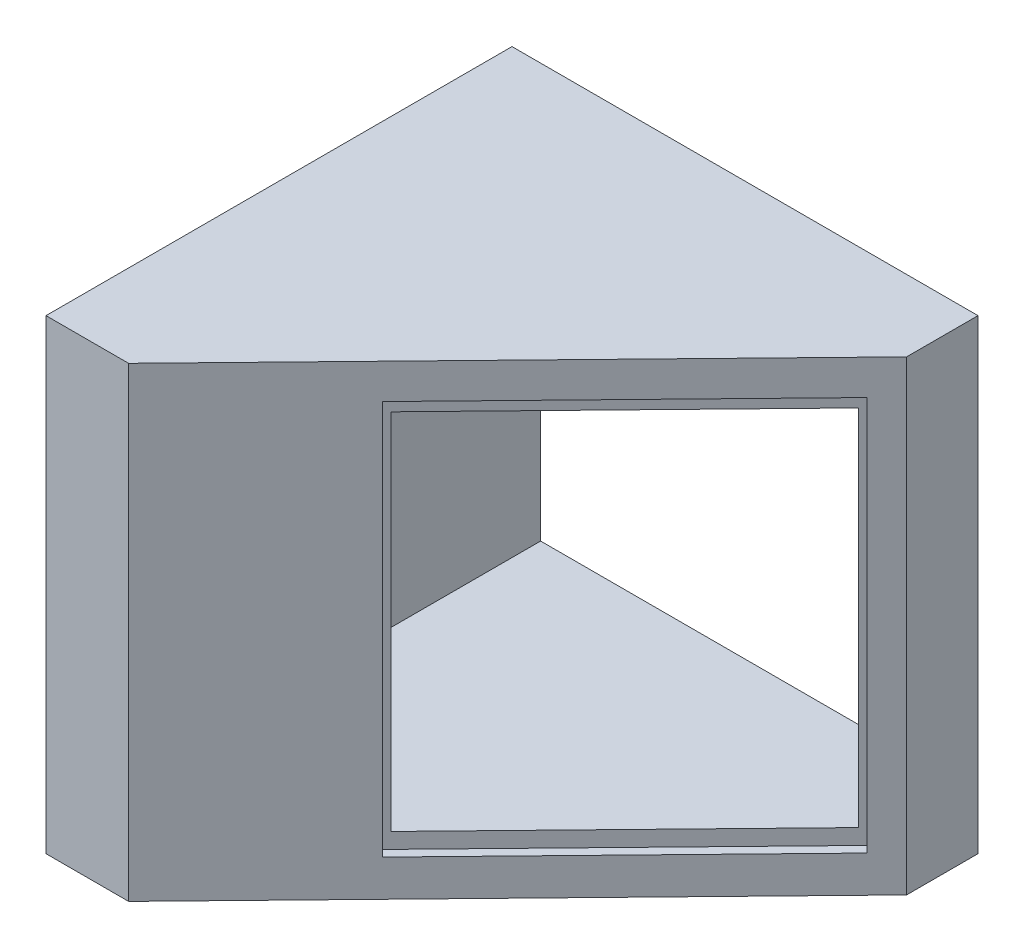
ISO-10303-21;
HEADER;
FILE_DESCRIPTION(('STEP AP214'),'2;1');
FILE_NAME('part.step','',(''),(''),'','','');
FILE_SCHEMA(('AUTOMOTIVE_DESIGN { 1 0 10303 214 1 1 1 1 }'));
ENDSEC;
DATA;
#1=APPLICATION_CONTEXT('core data for automotive mechanical design processes');
#2=APPLICATION_PROTOCOL_DEFINITION('international standard','automotive_design',2000,#1);
#3=PRODUCT_CONTEXT('',#1,'mechanical');
#4=PRODUCT('Part','Part','',(#3));
#5=PRODUCT_RELATED_PRODUCT_CATEGORY('part','',(#4));
#6=PRODUCT_DEFINITION_FORMATION('','',#4);
#7=PRODUCT_DEFINITION_CONTEXT('part definition',#1,'design');
#8=PRODUCT_DEFINITION('design','',#6,#7);
#9=PRODUCT_DEFINITION_SHAPE('','',#8);
#10=(LENGTH_UNIT() NAMED_UNIT(*) SI_UNIT(.MILLI.,.METRE.));
#11=(NAMED_UNIT(*) PLANE_ANGLE_UNIT() SI_UNIT($,.RADIAN.));
#12=(NAMED_UNIT(*) SI_UNIT($,.STERADIAN.) SOLID_ANGLE_UNIT());
#13=UNCERTAINTY_MEASURE_WITH_UNIT(LENGTH_MEASURE(1.E-05),#10,'distance_accuracy_value','');
#14=(GEOMETRIC_REPRESENTATION_CONTEXT(3) GLOBAL_UNCERTAINTY_ASSIGNED_CONTEXT((#13)) GLOBAL_UNIT_ASSIGNED_CONTEXT((#10,
#11,#12)) REPRESENTATION_CONTEXT('',''));
#15=CARTESIAN_POINT('',(0.,0.,0.));
#16=DIRECTION('',(0.,0.,1.));
#17=DIRECTION('',(1.,0.,0.));
#18=AXIS2_PLACEMENT_3D('',#15,#16,#17);
#19=CARTESIAN_POINT('',(51.5509401054222,54.4883165125637,105.));
#20=DIRECTION('',(0.,1.,0.));
#21=DIRECTION('',(0.,0.,1.));
#22=AXIS2_PLACEMENT_3D('',#19,#20,#21);
#23=PLANE('',#22);
#24=DIRECTION('',(0.696812609304925,0.,-0.71725322412218));
#25=VECTOR('',#24,1.);
#26=CARTESIAN_POINT('',(52.8832434795801,54.4883165125637,27.3206280029093));
#27=LINE('',#26,#25);
#28=CARTESIAN_POINT('',(-22.5823857711019,54.4883165125637,105.));
#29=VERTEX_POINT('',#28);
#30=CARTESIAN_POINT('',(51.5509401054222,54.4883165125637,28.6920137641069));
#31=VERTEX_POINT('',#30);
#32=EDGE_CURVE('E158',#29,#31,#27,.T.);
#33=ORIENTED_EDGE('',*,*,#32,.F.);
#34=DIRECTION('',(1.,0.,0.));
#35=VECTOR('',#34,1.);
#36=CARTESIAN_POINT('',(51.5509401054222,54.4883165125637,105.));
#37=LINE('',#36,#35);
#38=CARTESIAN_POINT('',(-79.4933732269255,54.4883165125637,105.));
#39=VERTEX_POINT('',#38);
#40=EDGE_CURVE('E192',#39,#29,#37,.T.);
#41=ORIENTED_EDGE('',*,*,#40,.F.);
#42=DIRECTION('',(0.,0.,-1.));
#43=VECTOR('',#42,1.);
#44=CARTESIAN_POINT('',(-79.4933732269255,54.4883165125637,105.));
#45=LINE('',#44,#43);
#46=CARTESIAN_POINT('',(-79.4933732269255,54.4883165125637,0.));
#47=VERTEX_POINT('',#46);
#48=EDGE_CURVE('E206',#39,#47,#45,.T.);
#49=ORIENTED_EDGE('',*,*,#48,.T.);
#50=DIRECTION('',(1.,0.,0.));
#51=VECTOR('',#50,1.);
#52=CARTESIAN_POINT('',(51.5509401054222,54.4883165125637,0.));
#53=LINE('',#52,#51);
#54=CARTESIAN_POINT('',(51.5509401054222,54.4883165125637,0.));
#55=VERTEX_POINT('',#54);
#56=EDGE_CURVE('E189',#47,#55,#53,.T.);
#57=ORIENTED_EDGE('',*,*,#56,.T.);
#58=DIRECTION('',(0.,0.,-1.));
#59=VECTOR('',#58,1.);
#60=CARTESIAN_POINT('',(51.5509401054222,54.4883165125637,105.));
#61=LINE('',#60,#59);
#62=EDGE_CURVE('E203',#31,#55,#61,.T.);
#63=ORIENTED_EDGE('',*,*,#62,.F.);
#64=EDGE_LOOP('',(#33,#41,#49,#57,#63));
#65=FACE_BOUND('',#64,.T.);
#66=ADVANCED_FACE('F35',(#65),#23,.F.);
#67=CARTESIAN_POINT('',(0.,0.,105.));
#68=DIRECTION('',(0.,0.,-1.));
#69=DIRECTION('',(-1.,0.,0.));
#70=AXIS2_PLACEMENT_3D('',#67,#68,#69);
#71=PLANE('',#70);
#72=ORIENTED_EDGE('',*,*,#40,.T.);
#73=DIRECTION('',(0.,-1.,0.));
#74=VECTOR('',#73,1.);
#75=CARTESIAN_POINT('',(-22.5823857711019,0.,105.));
#76=LINE('',#75,#74);
#77=CARTESIAN_POINT('',(-22.5823857711019,-62.4896774723498,105.));
#78=VERTEX_POINT('',#77);
#79=EDGE_CURVE('E11',#29,#78,#76,.T.);
#80=ORIENTED_EDGE('',*,*,#79,.T.);
#81=DIRECTION('',(-1.,0.,0.));
#82=VECTOR('',#81,1.);
#83=CARTESIAN_POINT('',(51.5509401054221,-62.4896774723498,105.));
#84=LINE('',#83,#82);
#85=CARTESIAN_POINT('',(-79.4933732269256,-62.4896774723498,105.));
#86=VERTEX_POINT('',#85);
#87=EDGE_CURVE('E186',#78,#86,#84,.T.);
#88=ORIENTED_EDGE('',*,*,#87,.T.);
#89=DIRECTION('',(0.,1.,0.));
#90=VECTOR('',#89,1.);
#91=CARTESIAN_POINT('',(-79.4933732269255,54.4883165125637,105.));
#92=LINE('',#91,#90);
#93=EDGE_CURVE('E188',#86,#39,#92,.T.);
#94=ORIENTED_EDGE('',*,*,#93,.T.);
#95=EDGE_LOOP('',(#72,#80,#88,#94));
#96=FACE_BOUND('',#95,.T.);
#97=ADVANCED_FACE('F285',(#96),#71,.T.);
#98=CARTESIAN_POINT('',(-88.7126445139242,70.7407474732786,150.));
#99=DIRECTION('',(1.,0.,0.));
#100=DIRECTION('',(0.,1.,0.));
#101=AXIS2_PLACEMENT_3D('',#98,#99,#100);
#102=PLANE('',#101);
#103=DIRECTION('',(0.,-1.,0.));
#104=VECTOR('',#103,1.);
#105=CARTESIAN_POINT('',(-88.7126445139242,70.7407474732786,0.));
#106=LINE('',#105,#104);
#107=CARTESIAN_POINT('',(-88.7126445139242,70.7407474732786,0.));
#108=VERTEX_POINT('',#107);
#109=CARTESIAN_POINT('',(-88.7126445139242,-79.2592525267214,0.));
#110=VERTEX_POINT('',#109);
#111=EDGE_CURVE('E219',#108,#110,#106,.T.);
#112=ORIENTED_EDGE('',*,*,#111,.T.);
#113=DIRECTION('',(0.,0.,-1.));
#114=VECTOR('',#113,1.);
#115=CARTESIAN_POINT('',(-88.7126445139242,-79.2592525267214,150.));
#116=LINE('',#115,#114);
#117=CARTESIAN_POINT('',(-88.7126445139242,-79.2592525267214,150.));
#118=VERTEX_POINT('',#117);
#119=EDGE_CURVE('E43',#118,#110,#116,.T.);
#120=ORIENTED_EDGE('',*,*,#119,.F.);
#121=DIRECTION('',(0.,-1.,0.));
#122=VECTOR('',#121,1.);
#123=CARTESIAN_POINT('',(-88.7126445139242,70.7407474732786,150.));
#124=LINE('',#123,#122);
#125=CARTESIAN_POINT('',(-88.7126445139242,70.7407474732786,150.));
#126=VERTEX_POINT('',#125);
#127=EDGE_CURVE('E221',#126,#118,#124,.T.);
#128=ORIENTED_EDGE('',*,*,#127,.F.);
#129=DIRECTION('',(0.,0.,-1.));
#130=VECTOR('',#129,1.);
#131=CARTESIAN_POINT('',(-88.7126445139242,70.7407474732786,150.));
#132=LINE('',#131,#130);
#133=EDGE_CURVE('E230',#126,#108,#132,.T.);
#134=ORIENTED_EDGE('',*,*,#133,.T.);
#135=EDGE_LOOP('',(#112,#120,#128,#134));
#136=FACE_BOUND('',#135,.T.);
#137=ADVANCED_FACE('F37',(#136),#102,.F.);
#138=CARTESIAN_POINT('',(-88.7126445139242,-79.2592525267214,150.));
#139=DIRECTION('',(0.,1.,0.));
#140=DIRECTION('',(0.,0.,1.));
#141=AXIS2_PLACEMENT_3D('',#138,#139,#140);
#142=PLANE('',#141);
#143=DIRECTION('',(0.,0.,-1.));
#144=VECTOR('',#143,1.);
#145=CARTESIAN_POINT('',(61.2873554860758,-79.2592525267214,150.));
#146=LINE('',#145,#144);
#147=CARTESIAN_POINT('',(61.2873554860758,-79.2592525267214,22.9753041782399));
#148=VERTEX_POINT('',#147);
#149=CARTESIAN_POINT('',(61.2873554860758,-79.2592525267214,0.));
#150=VERTEX_POINT('',#149);
#151=EDGE_CURVE('E244',#148,#150,#146,.T.);
#152=ORIENTED_EDGE('',*,*,#151,.F.);
#153=DIRECTION('',(0.696812609304925,0.,-0.71725322412218));
#154=VECTOR('',#153,1.);
#155=CARTESIAN_POINT('',(61.2873554860758,-79.2592525267214,22.9753041782399));
#156=LINE('',#155,#154);
#157=CARTESIAN_POINT('',(-62.1173316800951,-79.2592525267214,150.));
#158=VERTEX_POINT('',#157);
#159=EDGE_CURVE('E205',#158,#148,#156,.T.);
#160=ORIENTED_EDGE('',*,*,#159,.F.);
#161=DIRECTION('',(1.,0.,0.));
#162=VECTOR('',#161,1.);
#163=CARTESIAN_POINT('',(-88.7126445139242,-79.2592525267214,150.));
#164=LINE('',#163,#162);
#165=EDGE_CURVE('E224',#118,#158,#164,.T.);
#166=ORIENTED_EDGE('',*,*,#165,.F.);
#167=ORIENTED_EDGE('',*,*,#119,.T.);
#168=DIRECTION('',(1.,0.,0.));
#169=VECTOR('',#168,1.);
#170=CARTESIAN_POINT('',(-88.7126445139242,-79.2592525267214,0.));
#171=LINE('',#170,#169);
#172=EDGE_CURVE('E233',#110,#150,#171,.T.);
#173=ORIENTED_EDGE('',*,*,#172,.T.);
#174=EDGE_LOOP('',(#152,#160,#166,#167,#173));
#175=FACE_BOUND('',#174,.T.);
#176=ADVANCED_FACE('F249',(#175),#142,.F.);
#177=CARTESIAN_POINT('',(61.2873554860758,70.7407474732786,150.));
#178=DIRECTION('',(-1.,0.,0.));
#179=DIRECTION('',(0.,-1.,0.));
#180=AXIS2_PLACEMENT_3D('',#177,#178,#179);
#181=PLANE('',#180);
#182=DIRECTION('',(0.,0.,-1.));
#183=VECTOR('',#182,1.);
#184=CARTESIAN_POINT('',(61.2873554860758,70.7407474732786,150.));
#185=LINE('',#184,#183);
#186=CARTESIAN_POINT('',(61.2873554860758,70.7407474732786,22.9753041782399));
#187=VERTEX_POINT('',#186);
#188=CARTESIAN_POINT('',(61.2873554860758,70.7407474732786,0.));
#189=VERTEX_POINT('',#188);
#190=EDGE_CURVE('E242',#187,#189,#185,.T.);
#191=ORIENTED_EDGE('',*,*,#190,.F.);
#192=DIRECTION('',(0.,-1.,0.));
#193=VECTOR('',#192,1.);
#194=CARTESIAN_POINT('',(61.2873554860758,70.7407474732786,22.9753041782399));
#195=LINE('',#194,#193);
#196=EDGE_CURVE('E216',#187,#148,#195,.T.);
#197=ORIENTED_EDGE('',*,*,#196,.T.);
#198=ORIENTED_EDGE('',*,*,#151,.T.);
#199=DIRECTION('',(0.,1.,0.));
#200=VECTOR('',#199,1.);
#201=CARTESIAN_POINT('',(61.2873554860758,70.7407474732786,0.));
#202=LINE('',#201,#200);
#203=EDGE_CURVE('E236',#150,#189,#202,.T.);
#204=ORIENTED_EDGE('',*,*,#203,.T.);
#205=EDGE_LOOP('',(#191,#197,#198,#204));
#206=FACE_BOUND('',#205,.T.);
#207=ADVANCED_FACE('F261',(#206),#181,.F.);
#208=CARTESIAN_POINT('',(-88.7126445139242,70.7407474732786,150.));
#209=DIRECTION('',(0.,-1.,0.));
#210=DIRECTION('',(0.,0.,-1.));
#211=AXIS2_PLACEMENT_3D('',#208,#209,#210);
#212=PLANE('',#211);
#213=DIRECTION('',(-1.,0.,0.));
#214=VECTOR('',#213,1.);
#215=CARTESIAN_POINT('',(-88.7126445139242,70.7407474732786,150.));
#216=LINE('',#215,#214);
#217=CARTESIAN_POINT('',(-62.1173316800951,70.7407474732786,150.));
#218=VERTEX_POINT('',#217);
#219=EDGE_CURVE('E228',#218,#126,#216,.T.);
#220=ORIENTED_EDGE('',*,*,#219,.F.);
#221=DIRECTION('',(0.696812609304925,0.,-0.71725322412218));
#222=VECTOR('',#221,1.);
#223=CARTESIAN_POINT('',(61.2873554860758,70.7407474732786,22.9753041782399));
#224=LINE('',#223,#222);
#225=EDGE_CURVE('E211',#218,#187,#224,.T.);
#226=ORIENTED_EDGE('',*,*,#225,.T.);
#227=ORIENTED_EDGE('',*,*,#190,.T.);
#228=DIRECTION('',(-1.,0.,0.));
#229=VECTOR('',#228,1.);
#230=CARTESIAN_POINT('',(-88.7126445139242,70.7407474732786,0.));
#231=LINE('',#230,#229);
#232=EDGE_CURVE('E225',#189,#108,#231,.T.);
#233=ORIENTED_EDGE('',*,*,#232,.T.);
#234=ORIENTED_EDGE('',*,*,#133,.F.);
#235=EDGE_LOOP('',(#220,#226,#227,#233,#234));
#236=FACE_BOUND('',#235,.T.);
#237=ADVANCED_FACE('F268',(#236),#212,.F.);
#238=CARTESIAN_POINT('',(0.,0.,150.));
#239=DIRECTION('',(0.,0.,1.));
#240=DIRECTION('',(1.,0.,0.));
#241=AXIS2_PLACEMENT_3D('',#238,#239,#240);
#242=PLANE('',#241);
#243=DIRECTION('',(0.,-1.,0.));
#244=VECTOR('',#243,1.);
#245=CARTESIAN_POINT('',(-62.1173316800951,70.7407474732786,150.));
#246=LINE('',#245,#244);
#247=EDGE_CURVE('E214',#218,#158,#246,.T.);
#248=ORIENTED_EDGE('',*,*,#247,.F.);
#249=ORIENTED_EDGE('',*,*,#219,.T.);
#250=ORIENTED_EDGE('',*,*,#127,.T.);
#251=ORIENTED_EDGE('',*,*,#165,.T.);
#252=EDGE_LOOP('',(#248,#249,#250,#251));
#253=FACE_BOUND('',#252,.T.);
#254=ADVANCED_FACE('F265',(#253),#242,.T.);
#255=CARTESIAN_POINT('',(0.,0.,0.));
#256=DIRECTION('',(0.,0.,1.));
#257=DIRECTION('',(1.,0.,0.));
#258=AXIS2_PLACEMENT_3D('',#255,#256,#257);
#259=PLANE('',#258);
#260=DIRECTION('',(-1.,0.,0.));
#261=VECTOR('',#260,1.);
#262=CARTESIAN_POINT('',(51.5509401054221,-62.4896774723498,0.));
#263=LINE('',#262,#261);
#264=CARTESIAN_POINT('',(51.5509401054221,-62.4896774723498,0.));
#265=VERTEX_POINT('',#264);
#266=CARTESIAN_POINT('',(-79.4933732269256,-62.4896774723498,0.));
#267=VERTEX_POINT('',#266);
#268=EDGE_CURVE('E196',#265,#267,#263,.T.);
#269=ORIENTED_EDGE('',*,*,#268,.F.);
#270=DIRECTION('',(0.,-1.,0.));
#271=VECTOR('',#270,1.);
#272=CARTESIAN_POINT('',(51.5509401054222,54.4883165125637,0.));
#273=LINE('',#272,#271);
#274=EDGE_CURVE('E184',#55,#265,#273,.T.);
#275=ORIENTED_EDGE('',*,*,#274,.F.);
#276=ORIENTED_EDGE('',*,*,#56,.F.);
#277=DIRECTION('',(0.,1.,0.));
#278=VECTOR('',#277,1.);
#279=CARTESIAN_POINT('',(-79.4933732269255,54.4883165125637,0.));
#280=LINE('',#279,#278);
#281=EDGE_CURVE('E198',#267,#47,#280,.T.);
#282=ORIENTED_EDGE('',*,*,#281,.F.);
#283=EDGE_LOOP('',(#269,#275,#276,#282));
#284=FACE_BOUND('',#283,.T.);
#285=ORIENTED_EDGE('',*,*,#111,.F.);
#286=ORIENTED_EDGE('',*,*,#232,.F.);
#287=ORIENTED_EDGE('',*,*,#203,.F.);
#288=ORIENTED_EDGE('',*,*,#172,.F.);
#289=EDGE_LOOP('',(#285,#286,#287,#288));
#290=FACE_BOUND('',#289,.T.);
#291=ADVANCED_FACE('F258',(#284,#290),#259,.F.);
#292=CARTESIAN_POINT('',(61.2873554860758,70.7407474732786,22.9753041782399));
#293=DIRECTION('',(-0.71725322412218,0.,-0.696812609304925));
#294=DIRECTION('',(-0.696812609304925,0.,0.71725322412218));
#295=AXIS2_PLACEMENT_3D('',#292,#293,#294);
#296=PLANE('',#295);
#297=DIRECTION('',(-0.696812609304925,0.,0.71725322412218));
#298=VECTOR('',#297,1.);
#299=CARTESIAN_POINT('',(55.0350031519468,59.4883165125637,29.4110658308243));
#300=LINE('',#299,#298);
#301=CARTESIAN_POINT('',(55.0350031519468,59.4883165125637,29.4110658308243));
#302=VERTEX_POINT('',#301);
#303=CARTESIAN_POINT('',(-21.8523758084735,59.4883165125637,108.553893783773));
#304=VERTEX_POINT('',#303);
#305=EDGE_CURVE('E163',#302,#304,#300,.T.);
#306=ORIENTED_EDGE('',*,*,#305,.F.);
#307=DIRECTION('',(0.,1.,0.));
#308=VECTOR('',#307,1.);
#309=CARTESIAN_POINT('',(55.0350031519468,-67.4896774723498,29.4110658308243));
#310=LINE('',#309,#308);
#311=CARTESIAN_POINT('',(55.0350031519468,-67.4896774723498,29.4110658308243));
#312=VERTEX_POINT('',#311);
#313=EDGE_CURVE('E148',#312,#302,#310,.T.);
#314=ORIENTED_EDGE('',*,*,#313,.F.);
#315=DIRECTION('',(0.696812609304925,0.,-0.71725322412218));
#316=VECTOR('',#315,1.);
#317=CARTESIAN_POINT('',(-21.8523758084735,-67.4896774723498,108.553893783773));
#318=LINE('',#317,#316);
#319=CARTESIAN_POINT('',(-21.8523758084735,-67.4896774723498,108.553893783773));
#320=VERTEX_POINT('',#319);
#321=EDGE_CURVE('E174',#320,#312,#318,.T.);
#322=ORIENTED_EDGE('',*,*,#321,.F.);
#323=DIRECTION('',(0.,-1.,0.));
#324=VECTOR('',#323,1.);
#325=CARTESIAN_POINT('',(-21.8523758084735,-62.4896774723498,108.553893783774));
#326=LINE('',#325,#324);
#327=EDGE_CURVE('E181',#304,#320,#326,.T.);
#328=ORIENTED_EDGE('',*,*,#327,.F.);
#329=EDGE_LOOP('',(#306,#314,#322,#328));
#330=FACE_BOUND('',#329,.T.);
#331=ORIENTED_EDGE('',*,*,#159,.T.);
#332=ORIENTED_EDGE('',*,*,#196,.F.);
#333=ORIENTED_EDGE('',*,*,#225,.F.);
#334=ORIENTED_EDGE('',*,*,#247,.T.);
#335=EDGE_LOOP('',(#331,#332,#333,#334));
#336=FACE_BOUND('',#335,.T.);
#337=ADVANCED_FACE('F269',(#330,#336),#296,.F.);
#338=CARTESIAN_POINT('',(51.5509401054222,54.4883165125637,105.));
#339=DIRECTION('',(1.,0.,0.));
#340=DIRECTION('',(0.,1.,0.));
#341=AXIS2_PLACEMENT_3D('',#338,#339,#340);
#342=PLANE('',#341);
#343=DIRECTION('',(0.,0.,-1.));
#344=VECTOR('',#343,1.);
#345=CARTESIAN_POINT('',(51.5509401054221,-62.4896774723498,105.));
#346=LINE('',#345,#344);
#347=CARTESIAN_POINT('',(51.5509401054221,-62.4896774723498,28.6920137641069));
#348=VERTEX_POINT('',#347);
#349=EDGE_CURVE('E56',#348,#265,#346,.T.);
#350=ORIENTED_EDGE('',*,*,#349,.F.);
#351=DIRECTION('',(0.,1.,0.));
#352=VECTOR('',#351,1.);
#353=CARTESIAN_POINT('',(51.5509401054222,54.4883165125637,28.6920137641069));
#354=LINE('',#353,#352);
#355=EDGE_CURVE('E171',#348,#31,#354,.T.);
#356=ORIENTED_EDGE('',*,*,#355,.T.);
#357=ORIENTED_EDGE('',*,*,#62,.T.);
#358=ORIENTED_EDGE('',*,*,#274,.T.);
#359=EDGE_LOOP('',(#350,#356,#357,#358));
#360=FACE_BOUND('',#359,.T.);
#361=ADVANCED_FACE('F271',(#360),#342,.F.);
#362=CARTESIAN_POINT('',(51.5509401054221,-62.4896774723498,105.));
#363=DIRECTION('',(0.,-1.,0.));
#364=DIRECTION('',(0.,0.,-1.));
#365=AXIS2_PLACEMENT_3D('',#362,#363,#364);
#366=PLANE('',#365);
#367=DIRECTION('',(-0.696812609304925,0.,0.71725322412218));
#368=VECTOR('',#367,1.);
#369=CARTESIAN_POINT('',(-24.0041354808402,-62.4896774723498,106.463455955859));
#370=LINE('',#369,#368);
#371=EDGE_CURVE('E50',#348,#78,#370,.T.);
#372=ORIENTED_EDGE('',*,*,#371,.F.);
#373=ORIENTED_EDGE('',*,*,#349,.T.);
#374=ORIENTED_EDGE('',*,*,#268,.T.);
#375=DIRECTION('',(0.,0.,-1.));
#376=VECTOR('',#375,1.);
#377=CARTESIAN_POINT('',(-79.4933732269256,-62.4896774723498,105.));
#378=LINE('',#377,#376);
#379=EDGE_CURVE('E208',#86,#267,#378,.T.);
#380=ORIENTED_EDGE('',*,*,#379,.F.);
#381=ORIENTED_EDGE('',*,*,#87,.F.);
#382=EDGE_LOOP('',(#372,#373,#374,#380,#381));
#383=FACE_BOUND('',#382,.T.);
#384=ADVANCED_FACE('F278',(#383),#366,.F.);
#385=CARTESIAN_POINT('',(-79.4933732269255,54.4883165125637,105.));
#386=DIRECTION('',(-1.,0.,0.));
#387=DIRECTION('',(0.,-1.,0.));
#388=AXIS2_PLACEMENT_3D('',#385,#386,#387);
#389=PLANE('',#388);
#390=ORIENTED_EDGE('',*,*,#281,.T.);
#391=ORIENTED_EDGE('',*,*,#48,.F.);
#392=ORIENTED_EDGE('',*,*,#93,.F.);
#393=ORIENTED_EDGE('',*,*,#379,.T.);
#394=EDGE_LOOP('',(#390,#391,#392,#393));
#395=FACE_BOUND('',#394,.T.);
#396=ADVANCED_FACE('F295',(#395),#389,.F.);
#397=CARTESIAN_POINT('',(-24.0041354808402,-62.4896774723498,106.463455955859));
#398=DIRECTION('',(-0.696812609304925,0.,0.71725322412218));
#399=DIRECTION('',(0.71725322412218,0.,0.696812609304925));
#400=AXIS2_PLACEMENT_3D('',#397,#398,#399);
#401=PLANE('',#400);
#402=ORIENTED_EDGE('',*,*,#327,.T.);
#403=DIRECTION('',(0.71725322412218,0.,0.696812609304925));
#404=VECTOR('',#403,1.);
#405=CARTESIAN_POINT('',(-24.0041354808402,-67.4896774723498,106.463455955859));
#406=LINE('',#405,#404);
#407=CARTESIAN_POINT('',(-24.0041354808402,-67.4896774723498,106.463455955859));
#408=VERTEX_POINT('',#407);
#409=EDGE_CURVE('E177',#408,#320,#406,.T.);
#410=ORIENTED_EDGE('',*,*,#409,.F.);
#411=DIRECTION('',(0.,-1.,0.));
#412=VECTOR('',#411,1.);
#413=CARTESIAN_POINT('',(-24.0041354808402,-62.4896774723498,106.463455955859));
#414=LINE('',#413,#412);
#415=CARTESIAN_POINT('',(-24.0041354808402,59.4883165125637,106.463455955859));
#416=VERTEX_POINT('',#415);
#417=EDGE_CURVE('E182',#416,#408,#414,.T.);
#418=ORIENTED_EDGE('',*,*,#417,.F.);
#419=DIRECTION('',(0.71725322412218,0.,0.696812609304925));
#420=VECTOR('',#419,1.);
#421=CARTESIAN_POINT('',(-24.0041354808402,59.4883165125637,106.463455955859));
#422=LINE('',#421,#420);
#423=EDGE_CURVE('E157',#416,#304,#422,.T.);
#424=ORIENTED_EDGE('',*,*,#423,.T.);
#425=EDGE_LOOP('',(#402,#410,#418,#424));
#426=FACE_BOUND('',#425,.T.);
#427=ADVANCED_FACE('F298',(#426),#401,.F.);
#428=CARTESIAN_POINT('',(40.8605067572387,0.,39.6960450974328));
#429=DIRECTION('',(0.717253224122179,0.,0.696812609304926));
#430=DIRECTION('',(0.696812609304926,0.,-0.717253224122179));
#431=AXIS2_PLACEMENT_3D('',#428,#429,#430);
#432=PLANE('',#431);
#433=DIRECTION('',(-0.696812609304925,0.,0.71725322412218));
#434=VECTOR('',#433,1.);
#435=CARTESIAN_POINT('',(52.8832434795801,59.4883165125637,27.3206280029093));
#436=LINE('',#435,#434);
#437=CARTESIAN_POINT('',(52.8832434795801,59.4883165125637,27.3206280029093));
#438=VERTEX_POINT('',#437);
#439=EDGE_CURVE('E141',#438,#416,#436,.T.);
#440=ORIENTED_EDGE('',*,*,#439,.T.);
#441=ORIENTED_EDGE('',*,*,#417,.T.);
#442=DIRECTION('',(0.696812609304925,0.,-0.71725322412218));
#443=VECTOR('',#442,1.);
#444=CARTESIAN_POINT('',(-24.0041354808402,-67.4896774723498,106.463455955859));
#445=LINE('',#444,#443);
#446=CARTESIAN_POINT('',(52.8832434795801,-67.4896774723498,27.3206280029094));
#447=VERTEX_POINT('',#446);
#448=EDGE_CURVE('E143',#408,#447,#445,.T.);
#449=ORIENTED_EDGE('',*,*,#448,.T.);
#450=DIRECTION('',(0.,1.,0.));
#451=VECTOR('',#450,1.);
#452=CARTESIAN_POINT('',(52.8832434795801,-67.4896774723498,27.3206280029094));
#453=LINE('',#452,#451);
#454=EDGE_CURVE('E137',#447,#438,#453,.T.);
#455=ORIENTED_EDGE('',*,*,#454,.T.);
#456=EDGE_LOOP('',(#440,#441,#449,#455));
#457=FACE_BOUND('',#456,.T.);
#458=ORIENTED_EDGE('',*,*,#79,.F.);
#459=ORIENTED_EDGE('',*,*,#32,.T.);
#460=ORIENTED_EDGE('',*,*,#355,.F.);
#461=ORIENTED_EDGE('',*,*,#371,.T.);
#462=EDGE_LOOP('',(#458,#459,#460,#461));
#463=FACE_BOUND('',#462,.T.);
#464=ADVANCED_FACE('F139',(#457,#463),#432,.T.);
#465=CARTESIAN_POINT('',(-24.0041354808402,-67.4896774723498,106.463455955859));
#466=DIRECTION('',(0.,-1.,0.));
#467=DIRECTION('',(0.,0.,-1.));
#468=AXIS2_PLACEMENT_3D('',#465,#466,#467);
#469=PLANE('',#468);
#470=ORIENTED_EDGE('',*,*,#321,.T.);
#471=DIRECTION('',(0.71725322412218,0.,0.696812609304925));
#472=VECTOR('',#471,1.);
#473=CARTESIAN_POINT('',(52.8832434795801,-67.4896774723498,27.3206280029094));
#474=LINE('',#473,#472);
#475=EDGE_CURVE('E147',#447,#312,#474,.T.);
#476=ORIENTED_EDGE('',*,*,#475,.F.);
#477=ORIENTED_EDGE('',*,*,#448,.F.);
#478=ORIENTED_EDGE('',*,*,#409,.T.);
#479=EDGE_LOOP('',(#470,#476,#477,#478));
#480=FACE_BOUND('',#479,.T.);
#481=ADVANCED_FACE('F313',(#480),#469,.F.);
#482=CARTESIAN_POINT('',(52.8832434795801,-67.4896774723498,27.3206280029094));
#483=DIRECTION('',(0.696812609304925,0.,-0.71725322412218));
#484=DIRECTION('',(-0.71725322412218,0.,-0.696812609304925));
#485=AXIS2_PLACEMENT_3D('',#482,#483,#484);
#486=PLANE('',#485);
#487=ORIENTED_EDGE('',*,*,#313,.T.);
#488=DIRECTION('',(0.71725322412218,0.,0.696812609304925));
#489=VECTOR('',#488,1.);
#490=CARTESIAN_POINT('',(52.8832434795801,59.4883165125637,27.3206280029093));
#491=LINE('',#490,#489);
#492=EDGE_CURVE('E151',#438,#302,#491,.T.);
#493=ORIENTED_EDGE('',*,*,#492,.F.);
#494=ORIENTED_EDGE('',*,*,#454,.F.);
#495=ORIENTED_EDGE('',*,*,#475,.T.);
#496=EDGE_LOOP('',(#487,#493,#494,#495));
#497=FACE_BOUND('',#496,.T.);
#498=ADVANCED_FACE('F152',(#497),#486,.F.);
#499=CARTESIAN_POINT('',(52.8832434795801,59.4883165125637,27.3206280029093));
#500=DIRECTION('',(0.,1.,0.));
#501=DIRECTION('',(0.,0.,1.));
#502=AXIS2_PLACEMENT_3D('',#499,#500,#501);
#503=PLANE('',#502);
#504=ORIENTED_EDGE('',*,*,#305,.T.);
#505=ORIENTED_EDGE('',*,*,#423,.F.);
#506=ORIENTED_EDGE('',*,*,#439,.F.);
#507=ORIENTED_EDGE('',*,*,#492,.T.);
#508=EDGE_LOOP('',(#504,#505,#506,#507));
#509=FACE_BOUND('',#508,.T.);
#510=ADVANCED_FACE('F161',(#509),#503,.F.);
#511=CLOSED_SHELL('',(#66,#97,#137,#176,#207,#237,#254,#291,#337,#361,#384,#396,#427,#464,#481,
#498,#510));
#512=MANIFOLD_SOLID_BREP('B2',#511);
#513=ADVANCED_BREP_SHAPE_REPRESENTATION('',(#18,#512),#14);
#514=SHAPE_DEFINITION_REPRESENTATION(#9,#513);
ENDSEC;
END-ISO-10303-21;
